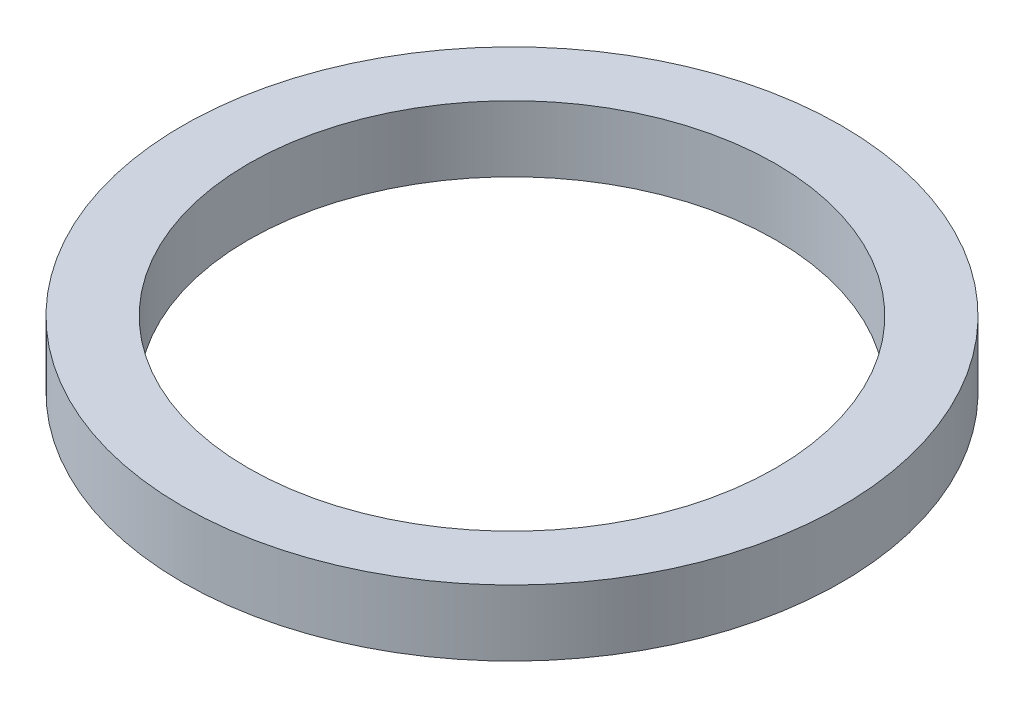
ISO-10303-21;
HEADER;
FILE_DESCRIPTION(('STEP AP214'),'2;1');
FILE_NAME('part.step','',(''),(''),'','','');
FILE_SCHEMA(('AUTOMOTIVE_DESIGN { 1 0 10303 214 1 1 1 1 }'));
ENDSEC;
DATA;
#1=APPLICATION_CONTEXT('core data for automotive mechanical design processes');
#2=APPLICATION_PROTOCOL_DEFINITION('international standard','automotive_design',2000,#1);
#3=PRODUCT_CONTEXT('',#1,'mechanical');
#4=PRODUCT('Part','Part','',(#3));
#5=PRODUCT_RELATED_PRODUCT_CATEGORY('part','',(#4));
#6=PRODUCT_DEFINITION_FORMATION('','',#4);
#7=PRODUCT_DEFINITION_CONTEXT('part definition',#1,'design');
#8=PRODUCT_DEFINITION('design','',#6,#7);
#9=PRODUCT_DEFINITION_SHAPE('','',#8);
#10=(LENGTH_UNIT() NAMED_UNIT(*) SI_UNIT(.MILLI.,.METRE.));
#11=(NAMED_UNIT(*) PLANE_ANGLE_UNIT() SI_UNIT($,.RADIAN.));
#12=(NAMED_UNIT(*) SI_UNIT($,.STERADIAN.) SOLID_ANGLE_UNIT());
#13=UNCERTAINTY_MEASURE_WITH_UNIT(LENGTH_MEASURE(1.E-05),#10,'distance_accuracy_value','');
#14=(GEOMETRIC_REPRESENTATION_CONTEXT(3) GLOBAL_UNCERTAINTY_ASSIGNED_CONTEXT((#13)) GLOBAL_UNIT_ASSIGNED_CONTEXT((#10,
#11,#12)) REPRESENTATION_CONTEXT('',''));
#15=CARTESIAN_POINT('',(0.,0.,0.));
#16=DIRECTION('',(0.,0.,1.));
#17=DIRECTION('',(1.,0.,0.));
#18=AXIS2_PLACEMENT_3D('',#15,#16,#17);
#19=CARTESIAN_POINT('',(0.,3.175,0.));
#20=DIRECTION('',(0.,1.,0.));
#21=DIRECTION('',(0.,0.,1.));
#22=AXIS2_PLACEMENT_3D('',#19,#20,#21);
#23=PLANE('',#22);
#24=CARTESIAN_POINT('',(0.,3.175,0.));
#25=DIRECTION('',(0.,1.,0.));
#26=DIRECTION('',(0.,0.,1.));
#27=AXIS2_PLACEMENT_3D('',#24,#25,#26);
#28=CIRCLE('',#27,15.875);
#29=CARTESIAN_POINT('',(0.,3.175,15.875));
#30=VERTEX_POINT('',#29);
#31=EDGE_CURVE('E10',#30,#30,#28,.T.);
#32=ORIENTED_EDGE('',*,*,#31,.T.);
#33=EDGE_LOOP('',(#32));
#34=FACE_BOUND('',#33,.T.);
#35=CARTESIAN_POINT('',(0.,3.175,0.));
#36=DIRECTION('',(0.,1.,0.));
#37=DIRECTION('',(0.,0.,1.));
#38=AXIS2_PLACEMENT_3D('',#35,#36,#37);
#39=CIRCLE('',#38,12.7);
#40=CARTESIAN_POINT('',(0.,3.175,12.7));
#41=VERTEX_POINT('',#40);
#42=EDGE_CURVE('E41',#41,#41,#39,.T.);
#43=ORIENTED_EDGE('',*,*,#42,.F.);
#44=EDGE_LOOP('',(#43));
#45=FACE_BOUND('',#44,.T.);
#46=ADVANCED_FACE('F30',(#34,#45),#23,.T.);
#47=CARTESIAN_POINT('',(0.,0.,0.));
#48=DIRECTION('',(0.,1.,0.));
#49=DIRECTION('',(0.,0.,1.));
#50=AXIS2_PLACEMENT_3D('',#47,#48,#49);
#51=PLANE('',#50);
#52=CARTESIAN_POINT('',(0.,0.,0.));
#53=DIRECTION('',(0.,1.,0.));
#54=DIRECTION('',(0.,0.,1.));
#55=AXIS2_PLACEMENT_3D('',#52,#53,#54);
#56=CIRCLE('',#55,15.875);
#57=CARTESIAN_POINT('',(0.,0.,15.875));
#58=VERTEX_POINT('',#57);
#59=EDGE_CURVE('E34',#58,#58,#56,.T.);
#60=ORIENTED_EDGE('',*,*,#59,.F.);
#61=EDGE_LOOP('',(#60));
#62=FACE_BOUND('',#61,.T.);
#63=CARTESIAN_POINT('',(0.,0.,0.));
#64=DIRECTION('',(0.,1.,0.));
#65=DIRECTION('',(0.,0.,1.));
#66=AXIS2_PLACEMENT_3D('',#63,#64,#65);
#67=CIRCLE('',#66,12.7);
#68=CARTESIAN_POINT('',(0.,0.,12.7));
#69=VERTEX_POINT('',#68);
#70=EDGE_CURVE('E43',#69,#69,#67,.T.);
#71=ORIENTED_EDGE('',*,*,#70,.T.);
#72=EDGE_LOOP('',(#71));
#73=FACE_BOUND('',#72,.T.);
#74=ADVANCED_FACE('F53',(#62,#73),#51,.F.);
#75=CARTESIAN_POINT('',(0.,3.175,0.));
#76=DIRECTION('',(0.,-1.,0.));
#77=DIRECTION('',(0.,0.,-1.));
#78=AXIS2_PLACEMENT_3D('',#75,#76,#77);
#79=CYLINDRICAL_SURFACE('',#78,15.875);
#80=ORIENTED_EDGE('',*,*,#31,.F.);
#81=EDGE_LOOP('',(#80));
#82=FACE_BOUND('',#81,.T.);
#83=ORIENTED_EDGE('',*,*,#59,.T.);
#84=EDGE_LOOP('',(#83));
#85=FACE_BOUND('',#84,.T.);
#86=ADVANCED_FACE('F32',(#82,#85),#79,.T.);
#87=CARTESIAN_POINT('',(0.,3.175,0.));
#88=DIRECTION('',(0.,-1.,0.));
#89=DIRECTION('',(0.,0.,-1.));
#90=AXIS2_PLACEMENT_3D('',#87,#88,#89);
#91=CYLINDRICAL_SURFACE('',#90,12.7);
#92=ORIENTED_EDGE('',*,*,#42,.T.);
#93=EDGE_LOOP('',(#92));
#94=FACE_BOUND('',#93,.T.);
#95=ORIENTED_EDGE('',*,*,#70,.F.);
#96=EDGE_LOOP('',(#95));
#97=FACE_BOUND('',#96,.T.);
#98=ADVANCED_FACE('F49',(#94,#97),#91,.F.);
#99=CLOSED_SHELL('',(#46,#74,#86,#98));
#100=MANIFOLD_SOLID_BREP('B2',#99);
#101=ADVANCED_BREP_SHAPE_REPRESENTATION('',(#18,#100),#14);
#102=SHAPE_DEFINITION_REPRESENTATION(#9,#101);
ENDSEC;
END-ISO-10303-21;
